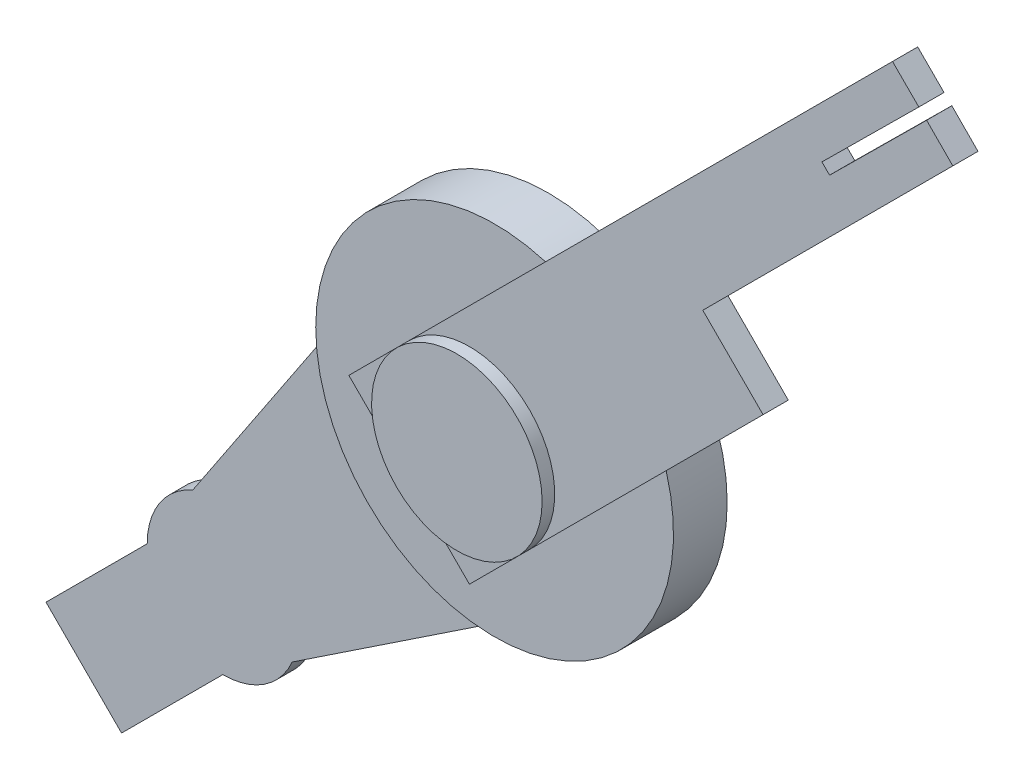
ISO-10303-21;
HEADER;
FILE_DESCRIPTION(('STEP AP214'),'2;1');
FILE_NAME('part.step','',(''),(''),'','','');
FILE_SCHEMA(('AUTOMOTIVE_DESIGN { 1 0 10303 214 1 1 1 1 }'));
ENDSEC;
DATA;
#1=APPLICATION_CONTEXT('core data for automotive mechanical design processes');
#2=APPLICATION_PROTOCOL_DEFINITION('international standard','automotive_design',2000,#1);
#3=PRODUCT_CONTEXT('',#1,'mechanical');
#4=PRODUCT('Part','Part','',(#3));
#5=PRODUCT_RELATED_PRODUCT_CATEGORY('part','',(#4));
#6=PRODUCT_DEFINITION_FORMATION('','',#4);
#7=PRODUCT_DEFINITION_CONTEXT('part definition',#1,'design');
#8=PRODUCT_DEFINITION('design','',#6,#7);
#9=PRODUCT_DEFINITION_SHAPE('','',#8);
#10=(LENGTH_UNIT() NAMED_UNIT(*) SI_UNIT(.MILLI.,.METRE.));
#11=(NAMED_UNIT(*) PLANE_ANGLE_UNIT() SI_UNIT($,.RADIAN.));
#12=(NAMED_UNIT(*) SI_UNIT($,.STERADIAN.) SOLID_ANGLE_UNIT());
#13=UNCERTAINTY_MEASURE_WITH_UNIT(LENGTH_MEASURE(1.E-05),#10,'distance_accuracy_value','');
#14=(GEOMETRIC_REPRESENTATION_CONTEXT(3) GLOBAL_UNCERTAINTY_ASSIGNED_CONTEXT((#13)) GLOBAL_UNIT_ASSIGNED_CONTEXT((#10,
#11,#12)) REPRESENTATION_CONTEXT('',''));
#15=CARTESIAN_POINT('',(0.,0.,0.));
#16=DIRECTION('',(0.,0.,1.));
#17=DIRECTION('',(1.,0.,0.));
#18=AXIS2_PLACEMENT_3D('',#15,#16,#17);
#19=CARTESIAN_POINT('',(0.,0.,3.49885));
#20=DIRECTION('',(0.,0.,1.));
#21=DIRECTION('',(1.,0.,0.));
#22=AXIS2_PLACEMENT_3D('',#19,#20,#21);
#23=PLANE('',#22);
#24=CARTESIAN_POINT('',(0.,0.,3.49885));
#25=DIRECTION('',(0.,0.,1.));
#26=DIRECTION('',(1.,0.,0.));
#27=AXIS2_PLACEMENT_3D('',#24,#25,#26);
#28=CIRCLE('',#27,3.78301250000001);
#29=CARTESIAN_POINT('',(-2.67499379206347,2.67499379206348,3.49885));
#30=VERTEX_POINT('',#29);
#31=CARTESIAN_POINT('',(-2.67499379206348,-2.67499379206347,3.49885));
#32=VERTEX_POINT('',#31);
#33=EDGE_CURVE('E288',#30,#32,#28,.T.);
#34=ORIENTED_EDGE('',*,*,#33,.F.);
#35=DIRECTION('',(-0.707106781186549,-0.707106781186546,0.));
#36=VECTOR('',#35,1.);
#37=CARTESIAN_POINT('',(-2.67499379206346,2.67499379206347,3.49885));
#38=LINE('',#37,#36);
#39=CARTESIAN_POINT('',(-5.34998758412694,0.,3.49885));
#40=VERTEX_POINT('',#39);
#41=EDGE_CURVE('E274',#30,#40,#38,.T.);
#42=ORIENTED_EDGE('',*,*,#41,.T.);
#43=DIRECTION('',(0.707106781186546,-0.707106781186549,0.));
#44=VECTOR('',#43,1.);
#45=CARTESIAN_POINT('',(-2.67499379206348,-2.67499379206347,3.49885));
#46=LINE('',#45,#44);
#47=EDGE_CURVE('E289',#40,#32,#46,.T.);
#48=ORIENTED_EDGE('',*,*,#47,.T.);
#49=EDGE_LOOP('',(#34,#42,#48));
#50=FACE_BOUND('',#49,.T.);
#51=ADVANCED_FACE('F125',(#50),#23,.T.);
#52=CARTESIAN_POINT('',(2.67499379206348,-2.67499379206349,3.49885));
#53=VERTEX_POINT('',#52);
#54=EDGE_CURVE('E134',#32,#53,#28,.T.);
#55=ORIENTED_EDGE('',*,*,#54,.F.);
#56=CARTESIAN_POINT('',(0.,-5.34998758412696,3.49885));
#57=VERTEX_POINT('',#56);
#58=EDGE_CURVE('E273',#32,#57,#46,.T.);
#59=ORIENTED_EDGE('',*,*,#58,.T.);
#60=DIRECTION('',(0.707106781186549,0.707106781186546,0.));
#61=VECTOR('',#60,1.);
#62=CARTESIAN_POINT('',(2.67499379206348,-2.67499379206349,3.49885));
#63=LINE('',#62,#61);
#64=EDGE_CURVE('E335',#57,#53,#63,.T.);
#65=ORIENTED_EDGE('',*,*,#64,.T.);
#66=EDGE_LOOP('',(#55,#59,#65));
#67=FACE_BOUND('',#66,.T.);
#68=ADVANCED_FACE('F549',(#67),#23,.T.);
#69=CARTESIAN_POINT('',(-1.67639999999993,1.67639999999993,0.79375));
#70=DIRECTION('',(-0.707106781186546,0.707106781186549,0.));
#71=DIRECTION('',(-0.707106781186549,-0.707106781186546,0.));
#72=AXIS2_PLACEMENT_3D('',#69,#70,#71);
#73=PLANE('',#72);
#74=DIRECTION('',(0.707106781186549,0.707106781186546,0.));
#75=VECTOR('',#74,1.);
#76=CARTESIAN_POINT('',(-1.67639999999993,1.67639999999993,0.));
#77=LINE('',#76,#75);
#78=CARTESIAN_POINT('',(-21.4910905502161,-18.1382905502161,0.));
#79=VERTEX_POINT('',#78);
#80=CARTESIAN_POINT('',(-17.0009624896815,-13.6481624896816,0.));
#81=VERTEX_POINT('',#80);
#82=EDGE_CURVE('E431',#79,#81,#77,.T.);
#83=ORIENTED_EDGE('',*,*,#82,.F.);
#84=DIRECTION('',(0.,0.,-1.));
#85=VECTOR('',#84,1.);
#86=CARTESIAN_POINT('',(-21.4910905502161,-18.1382905502161,0.79375));
#87=LINE('',#86,#85);
#88=CARTESIAN_POINT('',(-21.4910905502161,-18.1382905502161,0.79375));
#89=VERTEX_POINT('',#88);
#90=EDGE_CURVE('E448',#89,#79,#87,.T.);
#91=ORIENTED_EDGE('',*,*,#90,.F.);
#92=DIRECTION('',(0.707106781186549,0.707106781186546,0.));
#93=VECTOR('',#92,1.);
#94=CARTESIAN_POINT('',(-1.67639999999993,1.67639999999993,0.79375));
#95=LINE('',#94,#93);
#96=CARTESIAN_POINT('',(-17.0009624896815,-13.6481624896816,0.79375));
#97=VERTEX_POINT('',#96);
#98=EDGE_CURVE('E417',#89,#97,#95,.T.);
#99=ORIENTED_EDGE('',*,*,#98,.T.);
#100=DIRECTION('',(0.,0.,-1.));
#101=VECTOR('',#100,1.);
#102=CARTESIAN_POINT('',(-17.0009624896815,-13.6481624896816,0.79375));
#103=LINE('',#102,#101);
#104=EDGE_CURVE('E300',#97,#81,#103,.T.);
#105=ORIENTED_EDGE('',*,*,#104,.T.);
#106=EDGE_LOOP('',(#83,#91,#99,#105));
#107=FACE_BOUND('',#106,.T.);
#108=ADVANCED_FACE('F505',(#107),#73,.T.);
#109=CARTESIAN_POINT('',(0.,0.,0.));
#110=DIRECTION('',(0.,0.,1.));
#111=DIRECTION('',(1.,0.,0.));
#112=AXIS2_PLACEMENT_3D('',#109,#110,#111);
#113=PLANE('',#112);
#114=CARTESIAN_POINT('',(0.,0.,0.));
#115=DIRECTION('',(0.,0.,1.));
#116=DIRECTION('',(1.,0.,0.));
#117=AXIS2_PLACEMENT_3D('',#114,#115,#116);
#118=CIRCLE('',#117,1.905);
#119=CARTESIAN_POINT('',(1.905,0.,0.));
#120=VERTEX_POINT('',#119);
#121=EDGE_CURVE('E12',#120,#120,#118,.F.);
#122=ORIENTED_EDGE('',*,*,#121,.F.);
#123=EDGE_LOOP('',(#122));
#124=FACE_BOUND('',#123,.T.);
#125=ORIENTED_EDGE('',*,*,#82,.T.);
#126=CARTESIAN_POINT('',(-13.6481624896815,-13.6481624896816,0.));
#127=DIRECTION('',(0.,0.,1.));
#128=DIRECTION('',(1.,0.,0.));
#129=AXIS2_PLACEMENT_3D('',#126,#127,#128);
#130=CIRCLE('',#129,3.3528);
#131=CARTESIAN_POINT('',(-14.9775095482989,-10.5701592022003,0.));
#132=VERTEX_POINT('',#131);
#133=EDGE_CURVE('E471',#132,#81,#130,.T.);
#134=ORIENTED_EDGE('',*,*,#133,.F.);
#135=DIRECTION('',(-0.554331460495977,-0.832296000173254,0.));
#136=VECTOR('',#135,1.);
#137=CARTESIAN_POINT('',(-5.49843826574116,3.66210736764418,0.));
#138=LINE('',#137,#136);
#139=CARTESIAN_POINT('',(-7.9375,0.,0.));
#140=VERTEX_POINT('',#139);
#141=EDGE_CURVE('E412',#140,#132,#138,.T.);
#142=ORIENTED_EDGE('',*,*,#141,.F.);
#143=CARTESIAN_POINT('',(0.,0.,0.));
#144=DIRECTION('',(0.,0.,1.));
#145=DIRECTION('',(1.,0.,0.));
#146=AXIS2_PLACEMENT_3D('',#143,#144,#145);
#147=CIRCLE('',#146,7.9375);
#148=CARTESIAN_POINT('',(0.,-7.9375,0.));
#149=VERTEX_POINT('',#148);
#150=EDGE_CURVE('E458',#149,#140,#147,.T.);
#151=ORIENTED_EDGE('',*,*,#150,.F.);
#152=DIRECTION('',(-0.832296000173251,-0.554331460495982,0.));
#153=VECTOR('',#152,1.);
#154=CARTESIAN_POINT('',(3.66210736764421,-5.49843826574111,0.));
#155=LINE('',#154,#153);
#156=CARTESIAN_POINT('',(-10.5701592022003,-14.977509548299,0.));
#157=VERTEX_POINT('',#156);
#158=EDGE_CURVE('E476',#149,#157,#155,.T.);
#159=ORIENTED_EDGE('',*,*,#158,.T.);
#160=CARTESIAN_POINT('',(-13.6481624896815,-17.0009624896816,0.));
#161=VERTEX_POINT('',#160);
#162=EDGE_CURVE('E475',#161,#157,#130,.T.);
#163=ORIENTED_EDGE('',*,*,#162,.F.);
#164=DIRECTION('',(-0.70710678118655,-0.707106781186545,0.));
#165=VECTOR('',#164,1.);
#166=CARTESIAN_POINT('',(1.6764000000001,-1.67640000000011,0.));
#167=LINE('',#166,#165);
#168=CARTESIAN_POINT('',(-18.1382905502161,-21.4910905502161,0.));
#169=VERTEX_POINT('',#168);
#170=EDGE_CURVE('E422',#161,#169,#167,.T.);
#171=ORIENTED_EDGE('',*,*,#170,.T.);
#172=DIRECTION('',(-0.707106781186547,0.707106781186548,0.));
#173=VECTOR('',#172,1.);
#174=CARTESIAN_POINT('',(-19.8146905502161,-19.8146905502161,0.));
#175=LINE('',#174,#173);
#176=EDGE_CURVE('E435',#169,#79,#175,.T.);
#177=ORIENTED_EDGE('',*,*,#176,.T.);
#178=EDGE_LOOP('',(#125,#134,#142,#151,#159,#163,#171,#177));
#179=FACE_BOUND('',#178,.T.);
#180=ADVANCED_FACE('F500',(#124,#179),#113,.F.);
#181=CARTESIAN_POINT('',(-19.8146905502161,-19.8146905502161,0.79375));
#182=DIRECTION('',(-0.707106781186548,-0.707106781186547,0.));
#183=DIRECTION('',(0.707106781186547,-0.707106781186548,0.));
#184=AXIS2_PLACEMENT_3D('',#181,#182,#183);
#185=PLANE('',#184);
#186=ORIENTED_EDGE('',*,*,#176,.F.);
#187=DIRECTION('',(0.,0.,-1.));
#188=VECTOR('',#187,1.);
#189=CARTESIAN_POINT('',(-18.1382905502161,-21.4910905502161,0.79375));
#190=LINE('',#189,#188);
#191=CARTESIAN_POINT('',(-18.1382905502161,-21.4910905502161,0.79375));
#192=VERTEX_POINT('',#191);
#193=EDGE_CURVE('E445',#192,#169,#190,.T.);
#194=ORIENTED_EDGE('',*,*,#193,.F.);
#195=DIRECTION('',(-0.707106781186547,0.707106781186548,0.));
#196=VECTOR('',#195,1.);
#197=CARTESIAN_POINT('',(-19.8146905502161,-19.8146905502161,0.79375));
#198=LINE('',#197,#196);
#199=EDGE_CURVE('E421',#192,#89,#198,.T.);
#200=ORIENTED_EDGE('',*,*,#199,.T.);
#201=ORIENTED_EDGE('',*,*,#90,.T.);
#202=EDGE_LOOP('',(#186,#194,#200,#201));
#203=FACE_BOUND('',#202,.T.);
#204=ADVANCED_FACE('F547',(#203),#185,.T.);
#205=CARTESIAN_POINT('',(1.6764000000001,-1.67640000000011,0.79375));
#206=DIRECTION('',(0.707106781186545,-0.70710678118655,0.));
#207=DIRECTION('',(0.70710678118655,0.707106781186545,0.));
#208=AXIS2_PLACEMENT_3D('',#205,#206,#207);
#209=PLANE('',#208);
#210=ORIENTED_EDGE('',*,*,#170,.F.);
#211=DIRECTION('',(0.,0.,-1.));
#212=VECTOR('',#211,1.);
#213=CARTESIAN_POINT('',(-13.6481624896815,-17.0009624896816,0.79375));
#214=LINE('',#213,#212);
#215=CARTESIAN_POINT('',(-13.6481624896815,-17.0009624896816,0.79375));
#216=VERTEX_POINT('',#215);
#217=EDGE_CURVE('E430',#216,#161,#214,.T.);
#218=ORIENTED_EDGE('',*,*,#217,.F.);
#219=DIRECTION('',(-0.70710678118655,-0.707106781186545,0.));
#220=VECTOR('',#219,1.);
#221=CARTESIAN_POINT('',(1.6764000000001,-1.67640000000011,0.79375));
#222=LINE('',#221,#220);
#223=EDGE_CURVE('E426',#216,#192,#222,.T.);
#224=ORIENTED_EDGE('',*,*,#223,.T.);
#225=ORIENTED_EDGE('',*,*,#193,.T.);
#226=EDGE_LOOP('',(#210,#218,#224,#225));
#227=FACE_BOUND('',#226,.T.);
#228=ADVANCED_FACE('F554',(#227),#209,.T.);
#229=CARTESIAN_POINT('',(0.,0.,0.79375));
#230=DIRECTION('',(0.,0.,1.));
#231=DIRECTION('',(1.,0.,0.));
#232=AXIS2_PLACEMENT_3D('',#229,#230,#231);
#233=PLANE('',#232);
#234=CARTESIAN_POINT('',(0.,0.,0.79375));
#235=DIRECTION('',(0.,0.,1.));
#236=DIRECTION('',(1.,0.,0.));
#237=AXIS2_PLACEMENT_3D('',#234,#235,#236);
#238=CIRCLE('',#237,7.9375);
#239=CARTESIAN_POINT('',(-7.9375,0.,0.79375));
#240=VERTEX_POINT('',#239);
#241=CARTESIAN_POINT('',(0.,-7.9375,0.79375));
#242=VERTEX_POINT('',#241);
#243=EDGE_CURVE('E407',#240,#242,#238,.T.);
#244=ORIENTED_EDGE('',*,*,#243,.F.);
#245=DIRECTION('',(-0.554331460495977,-0.832296000173254,0.));
#246=VECTOR('',#245,1.);
#247=CARTESIAN_POINT('',(-5.49843826574116,3.66210736764418,0.79375));
#248=LINE('',#247,#246);
#249=CARTESIAN_POINT('',(-14.9775095482989,-10.5701592022003,0.79375));
#250=VERTEX_POINT('',#249);
#251=EDGE_CURVE('E453',#240,#250,#248,.T.);
#252=ORIENTED_EDGE('',*,*,#251,.T.);
#253=CARTESIAN_POINT('',(-13.6481624896815,-13.6481624896816,0.79375));
#254=DIRECTION('',(0.,0.,1.));
#255=DIRECTION('',(1.,0.,0.));
#256=AXIS2_PLACEMENT_3D('',#253,#254,#255);
#257=CIRCLE('',#256,3.3528);
#258=EDGE_CURVE('E457',#250,#97,#257,.T.);
#259=ORIENTED_EDGE('',*,*,#258,.T.);
#260=ORIENTED_EDGE('',*,*,#98,.F.);
#261=ORIENTED_EDGE('',*,*,#199,.F.);
#262=ORIENTED_EDGE('',*,*,#223,.F.);
#263=CARTESIAN_POINT('',(-10.5701592022003,-14.977509548299,0.79375));
#264=VERTEX_POINT('',#263);
#265=EDGE_CURVE('E462',#216,#264,#257,.T.);
#266=ORIENTED_EDGE('',*,*,#265,.T.);
#267=DIRECTION('',(-0.832296000173251,-0.554331460495982,0.));
#268=VECTOR('',#267,1.);
#269=CARTESIAN_POINT('',(3.66210736764421,-5.49843826574111,0.79375));
#270=LINE('',#269,#268);
#271=EDGE_CURVE('E463',#242,#264,#270,.T.);
#272=ORIENTED_EDGE('',*,*,#271,.F.);
#273=EDGE_LOOP('',(#244,#252,#259,#260,#261,#262,#266,#272));
#274=FACE_BOUND('',#273,.T.);
#275=ADVANCED_FACE('F509',(#274),#233,.T.);
#276=CARTESIAN_POINT('',(0.,0.,0.79375));
#277=DIRECTION('',(0.,0.,-1.));
#278=DIRECTION('',(-1.,0.,0.));
#279=AXIS2_PLACEMENT_3D('',#276,#277,#278);
#280=CYLINDRICAL_SURFACE('',#279,7.9375);
#281=ORIENTED_EDGE('',*,*,#150,.T.);
#282=DIRECTION('',(0.,0.,-1.));
#283=VECTOR('',#282,1.);
#284=CARTESIAN_POINT('',(-7.9375,0.,0.79375));
#285=LINE('',#284,#283);
#286=EDGE_CURVE('E467',#240,#140,#285,.T.);
#287=ORIENTED_EDGE('',*,*,#286,.F.);
#288=ORIENTED_EDGE('',*,*,#243,.T.);
#289=DIRECTION('',(0.,0.,-1.));
#290=VECTOR('',#289,1.);
#291=CARTESIAN_POINT('',(0.,-7.9375,0.79375));
#292=LINE('',#291,#290);
#293=EDGE_CURVE('E485',#242,#149,#292,.T.);
#294=ORIENTED_EDGE('',*,*,#293,.T.);
#295=EDGE_LOOP('',(#281,#287,#288,#294));
#296=FACE_BOUND('',#295,.T.);
#297=CARTESIAN_POINT('',(0.,0.,2.38125));
#298=DIRECTION('',(0.,0.,1.));
#299=DIRECTION('',(1.,0.,0.));
#300=AXIS2_PLACEMENT_3D('',#297,#298,#299);
#301=CIRCLE('',#300,7.9375);
#302=CARTESIAN_POINT('',(7.60919700407471,2.25920941994772,2.38125));
#303=VERTEX_POINT('',#302);
#304=CARTESIAN_POINT('',(2.25920941994778,7.60919700407469,2.38125));
#305=VERTEX_POINT('',#304);
#306=EDGE_CURVE('E408',#303,#305,#301,.T.);
#307=ORIENTED_EDGE('',*,*,#306,.F.);
#308=EDGE_CURVE('E413',#305,#303,#301,.T.);
#309=ORIENTED_EDGE('',*,*,#308,.F.);
#310=EDGE_LOOP('',(#307,#309));
#311=FACE_BOUND('',#310,.T.);
#312=ADVANCED_FACE('F513',(#296,#311),#280,.T.);
#313=CARTESIAN_POINT('',(-5.49843826574116,3.66210736764418,0.79375));
#314=DIRECTION('',(0.832296000173254,-0.554331460495976,0.));
#315=DIRECTION('',(0.554331460495976,0.832296000173254,0.));
#316=AXIS2_PLACEMENT_3D('',#313,#314,#315);
#317=PLANE('',#316);
#318=ORIENTED_EDGE('',*,*,#141,.T.);
#319=DIRECTION('',(0.,0.,-1.));
#320=VECTOR('',#319,1.);
#321=CARTESIAN_POINT('',(-14.9775095482989,-10.5701592022003,0.79375));
#322=LINE('',#321,#320);
#323=EDGE_CURVE('E436',#250,#132,#322,.T.);
#324=ORIENTED_EDGE('',*,*,#323,.F.);
#325=ORIENTED_EDGE('',*,*,#251,.F.);
#326=ORIENTED_EDGE('',*,*,#286,.T.);
#327=EDGE_LOOP('',(#318,#324,#325,#326));
#328=FACE_BOUND('',#327,.T.);
#329=ADVANCED_FACE('F127',(#328),#317,.F.);
#330=CARTESIAN_POINT('',(3.66210736764421,-5.49843826574111,0.79375));
#331=DIRECTION('',(0.554331460495982,-0.83229600017325,0.));
#332=DIRECTION('',(0.832296000173251,0.554331460495982,0.));
#333=AXIS2_PLACEMENT_3D('',#330,#331,#332);
#334=PLANE('',#333);
#335=ORIENTED_EDGE('',*,*,#158,.F.);
#336=ORIENTED_EDGE('',*,*,#293,.F.);
#337=ORIENTED_EDGE('',*,*,#271,.T.);
#338=DIRECTION('',(0.,0.,-1.));
#339=VECTOR('',#338,1.);
#340=CARTESIAN_POINT('',(-10.5701592022003,-14.977509548299,0.79375));
#341=LINE('',#340,#339);
#342=EDGE_CURVE('E488',#264,#157,#341,.T.);
#343=ORIENTED_EDGE('',*,*,#342,.T.);
#344=EDGE_LOOP('',(#335,#336,#337,#343));
#345=FACE_BOUND('',#344,.T.);
#346=ADVANCED_FACE('F516',(#345),#334,.T.);
#347=CARTESIAN_POINT('',(-13.6481624896815,-13.6481624896816,0.79375));
#348=DIRECTION('',(0.,0.,-1.));
#349=DIRECTION('',(-1.,0.,0.));
#350=AXIS2_PLACEMENT_3D('',#347,#348,#349);
#351=CYLINDRICAL_SURFACE('',#350,3.3528);
#352=ORIENTED_EDGE('',*,*,#162,.T.);
#353=ORIENTED_EDGE('',*,*,#342,.F.);
#354=ORIENTED_EDGE('',*,*,#265,.F.);
#355=ORIENTED_EDGE('',*,*,#217,.T.);
#356=EDGE_LOOP('',(#352,#353,#354,#355));
#357=FACE_BOUND('',#356,.T.);
#358=ADVANCED_FACE('F523',(#357),#351,.T.);
#359=ORIENTED_EDGE('',*,*,#133,.T.);
#360=ORIENTED_EDGE('',*,*,#104,.F.);
#361=ORIENTED_EDGE('',*,*,#258,.F.);
#362=ORIENTED_EDGE('',*,*,#323,.T.);
#363=EDGE_LOOP('',(#359,#360,#361,#362));
#364=FACE_BOUND('',#363,.T.);
#365=ADVANCED_FACE('F494',(#364),#351,.T.);
#366=CARTESIAN_POINT('',(0.,0.,2.38125));
#367=DIRECTION('',(0.,0.,1.));
#368=DIRECTION('',(1.,0.,0.));
#369=AXIS2_PLACEMENT_3D('',#366,#367,#368);
#370=PLANE('',#369);
#371=DIRECTION('',(0.707106781186549,0.707106781186546,0.));
#372=VECTOR('',#371,1.);
#373=CARTESIAN_POINT('',(2.67499379206348,-2.67499379206349,2.38125));
#374=LINE('',#373,#372);
#375=CARTESIAN_POINT('',(0.,-5.34998758412696,2.38125));
#376=VERTEX_POINT('',#375);
#377=EDGE_CURVE('E311',#376,#303,#374,.T.);
#378=ORIENTED_EDGE('',*,*,#377,.F.);
#379=DIRECTION('',(0.707106781186546,-0.707106781186549,0.));
#380=VECTOR('',#379,1.);
#381=CARTESIAN_POINT('',(-2.67499379206348,-2.67499379206347,2.38125));
#382=LINE('',#381,#380);
#383=CARTESIAN_POINT('',(-5.34998758412694,0.,2.38125));
#384=VERTEX_POINT('',#383);
#385=EDGE_CURVE('E368',#384,#376,#382,.T.);
#386=ORIENTED_EDGE('',*,*,#385,.F.);
#387=DIRECTION('',(-0.707106781186549,-0.707106781186546,0.));
#388=VECTOR('',#387,1.);
#389=CARTESIAN_POINT('',(-2.67499379206346,2.67499379206347,2.38125));
#390=LINE('',#389,#388);
#391=EDGE_CURVE('E297',#305,#384,#390,.T.);
#392=ORIENTED_EDGE('',*,*,#391,.F.);
#393=ORIENTED_EDGE('',*,*,#308,.T.);
#394=EDGE_LOOP('',(#378,#386,#392,#393));
#395=FACE_BOUND('',#394,.T.);
#396=ADVANCED_FACE('F614',(#395),#370,.T.);
#397=CARTESIAN_POINT('',(0.,0.,2.38125));
#398=DIRECTION('',(0.,0.,1.));
#399=DIRECTION('',(1.,0.,0.));
#400=AXIS2_PLACEMENT_3D('',#397,#398,#399);
#401=PLANE('',#400);
#402=CARTESIAN_POINT('',(13.0277653955702,7.67777781144319,2.38125));
#403=VERTEX_POINT('',#402);
#404=EDGE_CURVE('E372',#303,#403,#374,.T.);
#405=ORIENTED_EDGE('',*,*,#404,.F.);
#406=ORIENTED_EDGE('',*,*,#306,.T.);
#407=CARTESIAN_POINT('',(18.769780003,24.1197675871269,2.38125));
#408=VERTEX_POINT('',#407);
#409=EDGE_CURVE('E302',#408,#305,#390,.T.);
#410=ORIENTED_EDGE('',*,*,#409,.F.);
#411=DIRECTION('',(0.707106781186551,-0.707106781186544,0.));
#412=VECTOR('',#411,1.);
#413=CARTESIAN_POINT('',(21.4447737950634,21.4447737950636,2.38125));
#414=LINE('',#413,#412);
#415=CARTESIAN_POINT('',(19.937213298739,22.952334291388,2.38125));
#416=VERTEX_POINT('',#415);
#417=EDGE_CURVE('E363',#408,#416,#414,.T.);
#418=ORIENTED_EDGE('',*,*,#417,.T.);
#419=DIRECTION('',(-0.710521520271534,-0.703675471528622,0.));
#420=VECTOR('',#419,1.);
#421=CARTESIAN_POINT('',(-1.60353530250693,1.61913607486026,2.38125));
#422=LINE('',#421,#420);
#423=CARTESIAN_POINT('',(15.6394179196465,18.6959492226279,2.38125));
#424=VERTEX_POINT('',#423);
#425=EDGE_CURVE('E359',#416,#424,#422,.T.);
#426=ORIENTED_EDGE('',*,*,#425,.T.);
#427=DIRECTION('',(0.703675471528622,-0.710521520271534,0.));
#428=VECTOR('',#427,1.);
#429=CARTESIAN_POINT('',(17.2429532221534,17.0768131477676,2.38125));
#430=LINE('',#429,#428);
#431=CARTESIAN_POINT('',(15.9778770387788,18.3541972394967,2.38125));
#432=VERTEX_POINT('',#431);
#433=EDGE_CURVE('E355',#424,#432,#430,.T.);
#434=ORIENTED_EDGE('',*,*,#433,.T.);
#435=DIRECTION('',(0.710521520271534,0.703675471528621,0.));
#436=VECTOR('',#435,1.);
#437=CARTESIAN_POINT('',(-1.26507618337457,1.27738409172907,2.38125));
#438=LINE('',#437,#436);
#439=CARTESIAN_POINT('',(20.2830055915697,22.6178448250318,2.38125));
#440=VERTEX_POINT('',#439);
#441=EDGE_CURVE('E351',#432,#440,#438,.T.);
#442=ORIENTED_EDGE('',*,*,#441,.T.);
#443=DIRECTION('',(0.703675471528623,-0.710521520271532,0.));
#444=VECTOR('',#443,1.);
#445=CARTESIAN_POINT('',(21.5480817749442,21.3404607333028,2.38125));
#446=LINE('',#445,#444);
#447=CARTESIAN_POINT('',(21.4447737950635,21.4447737950635,2.38125));
#448=VERTEX_POINT('',#447);
#449=EDGE_CURVE('E347',#440,#448,#446,.T.);
#450=ORIENTED_EDGE('',*,*,#449,.T.);
#451=DIRECTION('',(0.707106781186546,0.707106781186549,0.));
#452=VECTOR('',#451,1.);
#453=CARTESIAN_POINT('',(0.,0.,2.38125));
#454=LINE('',#453,#452);
#455=CARTESIAN_POINT('',(10.3527716035067,10.3527716035067,2.38125));
#456=VERTEX_POINT('',#455);
#457=EDGE_CURVE('E343',#456,#448,#454,.T.);
#458=ORIENTED_EDGE('',*,*,#457,.F.);
#459=DIRECTION('',(-0.707106781186546,0.707106781186549,0.));
#460=VECTOR('',#459,1.);
#461=CARTESIAN_POINT('',(10.3527716035067,10.3527716035067,2.38125));
#462=LINE('',#461,#460);
#463=EDGE_CURVE('E339',#403,#456,#462,.T.);
#464=ORIENTED_EDGE('',*,*,#463,.F.);
#465=EDGE_LOOP('',(#405,#406,#410,#418,#426,#434,#442,#450,#458,#464));
#466=FACE_BOUND('',#465,.T.);
#467=ADVANCED_FACE('F582',(#466),#401,.F.);
#468=CARTESIAN_POINT('',(10.3527716035067,10.3527716035067,3.49885));
#469=DIRECTION('',(-0.707106781186549,-0.707106781186546,0.));
#470=DIRECTION('',(0.707106781186546,-0.707106781186549,0.));
#471=AXIS2_PLACEMENT_3D('',#468,#469,#470);
#472=PLANE('',#471);
#473=ORIENTED_EDGE('',*,*,#463,.T.);
#474=DIRECTION('',(0.,0.,-1.));
#475=VECTOR('',#474,1.);
#476=CARTESIAN_POINT('',(10.3527716035067,10.3527716035067,3.49885));
#477=LINE('',#476,#475);
#478=CARTESIAN_POINT('',(10.3527716035067,10.3527716035067,3.49885));
#479=VERTEX_POINT('',#478);
#480=EDGE_CURVE('E403',#479,#456,#477,.T.);
#481=ORIENTED_EDGE('',*,*,#480,.F.);
#482=DIRECTION('',(-0.707106781186546,0.707106781186549,0.));
#483=VECTOR('',#482,1.);
#484=CARTESIAN_POINT('',(10.3527716035067,10.3527716035067,3.49885));
#485=LINE('',#484,#483);
#486=CARTESIAN_POINT('',(13.0277653955702,7.67777781144319,3.49885));
#487=VERTEX_POINT('',#486);
#488=EDGE_CURVE('E306',#487,#479,#485,.T.);
#489=ORIENTED_EDGE('',*,*,#488,.F.);
#490=DIRECTION('',(0.,0.,-1.));
#491=VECTOR('',#490,1.);
#492=CARTESIAN_POINT('',(13.0277653955702,7.67777781144319,3.49885));
#493=LINE('',#492,#491);
#494=EDGE_CURVE('E338',#487,#403,#493,.T.);
#495=ORIENTED_EDGE('',*,*,#494,.T.);
#496=EDGE_LOOP('',(#473,#481,#489,#495));
#497=FACE_BOUND('',#496,.T.);
#498=ADVANCED_FACE('F609',(#497),#472,.F.);
#499=CARTESIAN_POINT('',(0.,0.,3.49885));
#500=DIRECTION('',(-0.707106781186549,0.707106781186546,0.));
#501=DIRECTION('',(-0.707106781186546,-0.707106781186549,0.));
#502=AXIS2_PLACEMENT_3D('',#499,#500,#501);
#503=PLANE('',#502);
#504=ORIENTED_EDGE('',*,*,#457,.T.);
#505=DIRECTION('',(0.,0.,-1.));
#506=VECTOR('',#505,1.);
#507=CARTESIAN_POINT('',(21.4447737950635,21.4447737950635,3.49885));
#508=LINE('',#507,#506);
#509=CARTESIAN_POINT('',(21.4447737950635,21.4447737950635,3.49885));
#510=VERTEX_POINT('',#509);
#511=EDGE_CURVE('E400',#510,#448,#508,.T.);
#512=ORIENTED_EDGE('',*,*,#511,.F.);
#513=DIRECTION('',(0.707106781186546,0.707106781186549,0.));
#514=VECTOR('',#513,1.);
#515=CARTESIAN_POINT('',(0.,0.,3.49885));
#516=LINE('',#515,#514);
#517=EDGE_CURVE('E310',#479,#510,#516,.T.);
#518=ORIENTED_EDGE('',*,*,#517,.F.);
#519=ORIENTED_EDGE('',*,*,#480,.T.);
#520=EDGE_LOOP('',(#504,#512,#518,#519));
#521=FACE_BOUND('',#520,.T.);
#522=ADVANCED_FACE('F605',(#521),#503,.F.);
#523=CARTESIAN_POINT('',(21.5480817749442,21.3404607333028,3.49885));
#524=DIRECTION('',(0.710521520271532,0.703675471528623,0.));
#525=DIRECTION('',(-0.703675471528623,0.710521520271532,0.));
#526=AXIS2_PLACEMENT_3D('',#523,#524,#525);
#527=PLANE('',#526);
#528=ORIENTED_EDGE('',*,*,#449,.F.);
#529=DIRECTION('',(0.,0.,-1.));
#530=VECTOR('',#529,1.);
#531=CARTESIAN_POINT('',(20.2830055915697,22.6178448250318,3.49885));
#532=LINE('',#531,#530);
#533=CARTESIAN_POINT('',(20.2830055915697,22.6178448250318,3.49885));
#534=VERTEX_POINT('',#533);
#535=EDGE_CURVE('E397',#534,#440,#532,.T.);
#536=ORIENTED_EDGE('',*,*,#535,.F.);
#537=DIRECTION('',(0.703675471528623,-0.710521520271532,0.));
#538=VECTOR('',#537,1.);
#539=CARTESIAN_POINT('',(21.5480817749442,21.3404607333028,3.49885));
#540=LINE('',#539,#538);
#541=EDGE_CURVE('E314',#534,#510,#540,.T.);
#542=ORIENTED_EDGE('',*,*,#541,.T.);
#543=ORIENTED_EDGE('',*,*,#511,.T.);
#544=EDGE_LOOP('',(#528,#536,#542,#543));
#545=FACE_BOUND('',#544,.T.);
#546=ADVANCED_FACE('F601',(#545),#527,.T.);
#547=CARTESIAN_POINT('',(-1.26507618337457,1.27738409172907,3.49885));
#548=DIRECTION('',(-0.703675471528621,0.710521520271534,0.));
#549=DIRECTION('',(-0.710521520271534,-0.703675471528621,0.));
#550=AXIS2_PLACEMENT_3D('',#547,#548,#549);
#551=PLANE('',#550);
#552=ORIENTED_EDGE('',*,*,#441,.F.);
#553=DIRECTION('',(0.,0.,-1.));
#554=VECTOR('',#553,1.);
#555=CARTESIAN_POINT('',(15.9778770387788,18.3541972394967,3.49885));
#556=LINE('',#555,#554);
#557=CARTESIAN_POINT('',(15.9778770387788,18.3541972394967,3.49885));
#558=VERTEX_POINT('',#557);
#559=EDGE_CURVE('E394',#558,#432,#556,.T.);
#560=ORIENTED_EDGE('',*,*,#559,.F.);
#561=DIRECTION('',(0.710521520271534,0.703675471528621,0.));
#562=VECTOR('',#561,1.);
#563=CARTESIAN_POINT('',(-1.26507618337457,1.27738409172907,3.49885));
#564=LINE('',#563,#562);
#565=EDGE_CURVE('E318',#558,#534,#564,.T.);
#566=ORIENTED_EDGE('',*,*,#565,.T.);
#567=ORIENTED_EDGE('',*,*,#535,.T.);
#568=EDGE_LOOP('',(#552,#560,#566,#567));
#569=FACE_BOUND('',#568,.T.);
#570=ADVANCED_FACE('F597',(#569),#551,.T.);
#571=CARTESIAN_POINT('',(17.2429532221534,17.0768131477676,3.49885));
#572=DIRECTION('',(0.710521520271534,0.703675471528622,0.));
#573=DIRECTION('',(-0.703675471528622,0.710521520271534,0.));
#574=AXIS2_PLACEMENT_3D('',#571,#572,#573);
#575=PLANE('',#574);
#576=ORIENTED_EDGE('',*,*,#433,.F.);
#577=DIRECTION('',(0.,0.,-1.));
#578=VECTOR('',#577,1.);
#579=CARTESIAN_POINT('',(15.6394179196465,18.6959492226279,3.49885));
#580=LINE('',#579,#578);
#581=CARTESIAN_POINT('',(15.6394179196465,18.6959492226279,3.49885));
#582=VERTEX_POINT('',#581);
#583=EDGE_CURVE('E391',#582,#424,#580,.T.);
#584=ORIENTED_EDGE('',*,*,#583,.F.);
#585=DIRECTION('',(0.703675471528622,-0.710521520271534,0.));
#586=VECTOR('',#585,1.);
#587=CARTESIAN_POINT('',(17.2429532221534,17.0768131477676,3.49885));
#588=LINE('',#587,#586);
#589=EDGE_CURVE('E322',#582,#558,#588,.T.);
#590=ORIENTED_EDGE('',*,*,#589,.T.);
#591=ORIENTED_EDGE('',*,*,#559,.T.);
#592=EDGE_LOOP('',(#576,#584,#590,#591));
#593=FACE_BOUND('',#592,.T.);
#594=ADVANCED_FACE('F593',(#593),#575,.T.);
#595=CARTESIAN_POINT('',(-1.60353530250693,1.61913607486026,3.49885));
#596=DIRECTION('',(0.703675471528622,-0.710521520271534,0.));
#597=DIRECTION('',(0.710521520271534,0.703675471528622,0.));
#598=AXIS2_PLACEMENT_3D('',#595,#596,#597);
#599=PLANE('',#598);
#600=ORIENTED_EDGE('',*,*,#425,.F.);
#601=DIRECTION('',(0.,0.,-1.));
#602=VECTOR('',#601,1.);
#603=CARTESIAN_POINT('',(19.937213298739,22.952334291388,3.49885));
#604=LINE('',#603,#602);
#605=CARTESIAN_POINT('',(19.937213298739,22.952334291388,3.49885));
#606=VERTEX_POINT('',#605);
#607=EDGE_CURVE('E388',#606,#416,#604,.T.);
#608=ORIENTED_EDGE('',*,*,#607,.F.);
#609=DIRECTION('',(-0.710521520271534,-0.703675471528622,0.));
#610=VECTOR('',#609,1.);
#611=CARTESIAN_POINT('',(-1.60353530250693,1.61913607486026,3.49885));
#612=LINE('',#611,#610);
#613=EDGE_CURVE('E326',#606,#582,#612,.T.);
#614=ORIENTED_EDGE('',*,*,#613,.T.);
#615=ORIENTED_EDGE('',*,*,#583,.T.);
#616=EDGE_LOOP('',(#600,#608,#614,#615));
#617=FACE_BOUND('',#616,.T.);
#618=ADVANCED_FACE('F589',(#617),#599,.T.);
#619=CARTESIAN_POINT('',(21.4447737950634,21.4447737950636,3.49885));
#620=DIRECTION('',(0.707106781186544,0.707106781186551,0.));
#621=DIRECTION('',(-0.707106781186551,0.707106781186544,0.));
#622=AXIS2_PLACEMENT_3D('',#619,#620,#621);
#623=PLANE('',#622);
#624=ORIENTED_EDGE('',*,*,#417,.F.);
#625=DIRECTION('',(0.,0.,-1.));
#626=VECTOR('',#625,1.);
#627=CARTESIAN_POINT('',(18.769780003,24.1197675871269,3.49885));
#628=LINE('',#627,#626);
#629=CARTESIAN_POINT('',(18.769780003,24.1197675871269,3.49885));
#630=VERTEX_POINT('',#629);
#631=EDGE_CURVE('E385',#630,#408,#628,.T.);
#632=ORIENTED_EDGE('',*,*,#631,.F.);
#633=DIRECTION('',(0.707106781186551,-0.707106781186544,0.));
#634=VECTOR('',#633,1.);
#635=CARTESIAN_POINT('',(21.4447737950634,21.4447737950636,3.49885));
#636=LINE('',#635,#634);
#637=EDGE_CURVE('E270',#630,#606,#636,.T.);
#638=ORIENTED_EDGE('',*,*,#637,.T.);
#639=ORIENTED_EDGE('',*,*,#607,.T.);
#640=EDGE_LOOP('',(#624,#632,#638,#639));
#641=FACE_BOUND('',#640,.T.);
#642=ADVANCED_FACE('F586',(#641),#623,.T.);
#643=CARTESIAN_POINT('',(-2.67499379206346,2.67499379206347,3.49885));
#644=DIRECTION('',(0.707106781186546,-0.707106781186549,0.));
#645=DIRECTION('',(0.707106781186549,0.707106781186546,0.));
#646=AXIS2_PLACEMENT_3D('',#643,#644,#645);
#647=PLANE('',#646);
#648=ORIENTED_EDGE('',*,*,#409,.T.);
#649=ORIENTED_EDGE('',*,*,#391,.T.);
#650=DIRECTION('',(0.,0.,-1.));
#651=VECTOR('',#650,1.);
#652=CARTESIAN_POINT('',(-5.34998758412694,0.,3.49885));
#653=LINE('',#652,#651);
#654=EDGE_CURVE('E282',#40,#384,#653,.T.);
#655=ORIENTED_EDGE('',*,*,#654,.F.);
#656=ORIENTED_EDGE('',*,*,#41,.F.);
#657=EDGE_CURVE('E265',#630,#30,#38,.T.);
#658=ORIENTED_EDGE('',*,*,#657,.F.);
#659=ORIENTED_EDGE('',*,*,#631,.T.);
#660=EDGE_LOOP('',(#648,#649,#655,#656,#658,#659));
#661=FACE_BOUND('',#660,.T.);
#662=ADVANCED_FACE('F279',(#661),#647,.F.);
#663=CARTESIAN_POINT('',(-2.67499379206348,-2.67499379206347,3.49885));
#664=DIRECTION('',(0.707106781186549,0.707106781186546,0.));
#665=DIRECTION('',(-0.707106781186546,0.707106781186549,0.));
#666=AXIS2_PLACEMENT_3D('',#663,#664,#665);
#667=PLANE('',#666);
#668=ORIENTED_EDGE('',*,*,#385,.T.);
#669=DIRECTION('',(0.,0.,-1.));
#670=VECTOR('',#669,1.);
#671=CARTESIAN_POINT('',(0.,-5.34998758412696,3.49885));
#672=LINE('',#671,#670);
#673=EDGE_CURVE('E379',#57,#376,#672,.T.);
#674=ORIENTED_EDGE('',*,*,#673,.F.);
#675=ORIENTED_EDGE('',*,*,#58,.F.);
#676=ORIENTED_EDGE('',*,*,#47,.F.);
#677=ORIENTED_EDGE('',*,*,#654,.T.);
#678=EDGE_LOOP('',(#668,#674,#675,#676,#677));
#679=FACE_BOUND('',#678,.T.);
#680=ADVANCED_FACE('F574',(#679),#667,.F.);
#681=CARTESIAN_POINT('',(2.67499379206348,-2.67499379206349,3.49885));
#682=DIRECTION('',(-0.707106781186546,0.707106781186549,0.));
#683=DIRECTION('',(-0.707106781186549,-0.707106781186546,0.));
#684=AXIS2_PLACEMENT_3D('',#681,#682,#683);
#685=PLANE('',#684);
#686=ORIENTED_EDGE('',*,*,#377,.T.);
#687=ORIENTED_EDGE('',*,*,#404,.T.);
#688=ORIENTED_EDGE('',*,*,#494,.F.);
#689=EDGE_CURVE('E334',#53,#487,#63,.T.);
#690=ORIENTED_EDGE('',*,*,#689,.F.);
#691=ORIENTED_EDGE('',*,*,#64,.F.);
#692=ORIENTED_EDGE('',*,*,#673,.T.);
#693=EDGE_LOOP('',(#686,#687,#688,#690,#691,#692));
#694=FACE_BOUND('',#693,.T.);
#695=ADVANCED_FACE('F568',(#694),#685,.F.);
#696=EDGE_CURVE('E141',#53,#30,#28,.T.);
#697=ORIENTED_EDGE('',*,*,#696,.F.);
#698=ORIENTED_EDGE('',*,*,#689,.T.);
#699=ORIENTED_EDGE('',*,*,#488,.T.);
#700=ORIENTED_EDGE('',*,*,#517,.T.);
#701=ORIENTED_EDGE('',*,*,#541,.F.);
#702=ORIENTED_EDGE('',*,*,#565,.F.);
#703=ORIENTED_EDGE('',*,*,#589,.F.);
#704=ORIENTED_EDGE('',*,*,#613,.F.);
#705=ORIENTED_EDGE('',*,*,#637,.F.);
#706=ORIENTED_EDGE('',*,*,#657,.T.);
#707=EDGE_LOOP('',(#697,#698,#699,#700,#701,#702,#703,#704,#705,#706));
#708=FACE_BOUND('',#707,.T.);
#709=ADVANCED_FACE('F267',(#708),#23,.T.);
#710=CARTESIAN_POINT('',(0.,0.,4.05765));
#711=DIRECTION('',(0.,0.,-1.));
#712=DIRECTION('',(-1.,0.,0.));
#713=AXIS2_PLACEMENT_3D('',#710,#711,#712);
#714=CYLINDRICAL_SURFACE('',#713,3.78301250000001);
#715=CARTESIAN_POINT('',(0.,0.,4.05765));
#716=DIRECTION('',(0.,0.,1.));
#717=DIRECTION('',(1.,0.,0.));
#718=AXIS2_PLACEMENT_3D('',#715,#716,#717);
#719=CIRCLE('',#718,3.78301250000001);
#720=CARTESIAN_POINT('',(3.78301250000001,0.,4.05765));
#721=VERTEX_POINT('',#720);
#722=EDGE_CURVE('E292',#721,#721,#719,.T.);
#723=ORIENTED_EDGE('',*,*,#722,.F.);
#724=EDGE_LOOP('',(#723));
#725=FACE_BOUND('',#724,.T.);
#726=ORIENTED_EDGE('',*,*,#33,.T.);
#727=ORIENTED_EDGE('',*,*,#54,.T.);
#728=ORIENTED_EDGE('',*,*,#696,.T.);
#729=EDGE_LOOP('',(#726,#727,#728));
#730=FACE_BOUND('',#729,.T.);
#731=ADVANCED_FACE('F295',(#725,#730),#714,.T.);
#732=CARTESIAN_POINT('',(0.,0.,4.05765));
#733=DIRECTION('',(0.,0.,1.));
#734=DIRECTION('',(1.,0.,0.));
#735=AXIS2_PLACEMENT_3D('',#732,#733,#734);
#736=PLANE('',#735);
#737=ORIENTED_EDGE('',*,*,#722,.T.);
#738=EDGE_LOOP('',(#737));
#739=FACE_BOUND('',#738,.T.);
#740=ADVANCED_FACE('F542',(#739),#736,.T.);
#741=CARTESIAN_POINT('',(0.,0.,-1.5875));
#742=DIRECTION('',(0.,0.,1.));
#743=DIRECTION('',(1.,0.,0.));
#744=AXIS2_PLACEMENT_3D('',#741,#742,#743);
#745=CYLINDRICAL_SURFACE('',#744,1.905);
#746=CARTESIAN_POINT('',(0.,0.,-1.5875));
#747=DIRECTION('',(0.,0.,-1.));
#748=DIRECTION('',(-1.,0.,0.));
#749=AXIS2_PLACEMENT_3D('',#746,#747,#748);
#750=CIRCLE('',#749,1.905);
#751=CARTESIAN_POINT('',(-1.905,0.,-1.5875));
#752=VERTEX_POINT('',#751);
#753=EDGE_CURVE('E293',#752,#752,#750,.T.);
#754=ORIENTED_EDGE('',*,*,#753,.F.);
#755=EDGE_LOOP('',(#754));
#756=FACE_BOUND('',#755,.T.);
#757=ORIENTED_EDGE('',*,*,#121,.T.);
#758=EDGE_LOOP('',(#757));
#759=FACE_BOUND('',#758,.T.);
#760=ADVANCED_FACE('F539',(#756,#759),#745,.T.);
#761=CARTESIAN_POINT('',(0.,0.,-1.5875));
#762=DIRECTION('',(0.,0.,-1.));
#763=DIRECTION('',(-1.,0.,0.));
#764=AXIS2_PLACEMENT_3D('',#761,#762,#763);
#765=PLANE('',#764);
#766=ORIENTED_EDGE('',*,*,#753,.T.);
#767=EDGE_LOOP('',(#766));
#768=FACE_BOUND('',#767,.T.);
#769=ADVANCED_FACE('F537',(#768),#765,.T.);
#770=CLOSED_SHELL('',(#51,#68,#108,#180,#204,#228,#275,#312,#329,#346,#358,#365,#396,#467,#498,
#522,#546,#570,#594,#618,#642,#662,#680,#695,#709,#731,#740,#760,#769));
#771=MANIFOLD_SOLID_BREP('B2',#770);
#772=ADVANCED_BREP_SHAPE_REPRESENTATION('',(#18,#771),#14);
#773=SHAPE_DEFINITION_REPRESENTATION(#9,#772);
ENDSEC;
END-ISO-10303-21;
